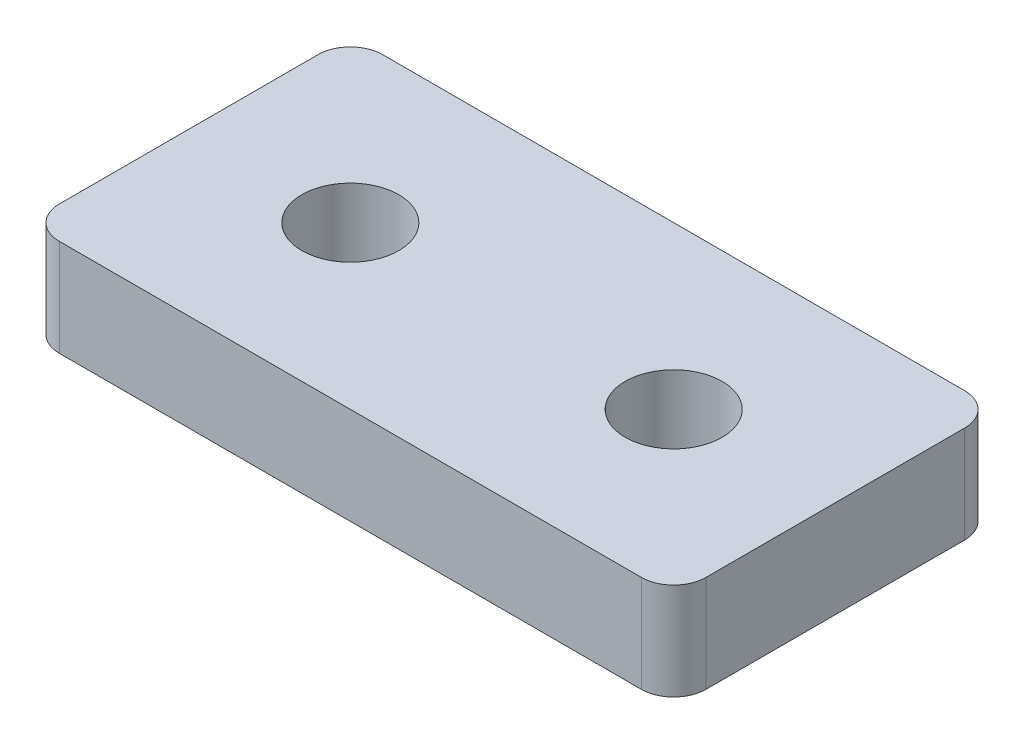
ISO-10303-21;
HEADER;
FILE_DESCRIPTION(('STEP AP214'),'2;1');
FILE_NAME('part.step','',(''),(''),'','','');
FILE_SCHEMA(('AUTOMOTIVE_DESIGN { 1 0 10303 214 1 1 1 1 }'));
ENDSEC;
DATA;
#1=APPLICATION_CONTEXT('core data for automotive mechanical design processes');
#2=APPLICATION_PROTOCOL_DEFINITION('international standard','automotive_design',2000,#1);
#3=PRODUCT_CONTEXT('',#1,'mechanical');
#4=PRODUCT('Part','Part','',(#3));
#5=PRODUCT_RELATED_PRODUCT_CATEGORY('part','',(#4));
#6=PRODUCT_DEFINITION_FORMATION('','',#4);
#7=PRODUCT_DEFINITION_CONTEXT('part definition',#1,'design');
#8=PRODUCT_DEFINITION('design','',#6,#7);
#9=PRODUCT_DEFINITION_SHAPE('','',#8);
#10=(LENGTH_UNIT() NAMED_UNIT(*) SI_UNIT(.MILLI.,.METRE.));
#11=(NAMED_UNIT(*) PLANE_ANGLE_UNIT() SI_UNIT($,.RADIAN.));
#12=(NAMED_UNIT(*) SI_UNIT($,.STERADIAN.) SOLID_ANGLE_UNIT());
#13=UNCERTAINTY_MEASURE_WITH_UNIT(LENGTH_MEASURE(1.E-05),#10,'distance_accuracy_value','');
#14=(GEOMETRIC_REPRESENTATION_CONTEXT(3) GLOBAL_UNCERTAINTY_ASSIGNED_CONTEXT((#13)) GLOBAL_UNIT_ASSIGNED_CONTEXT((#10,
#11,#12)) REPRESENTATION_CONTEXT('',''));
#15=CARTESIAN_POINT('',(0.,0.,0.));
#16=DIRECTION('',(0.,0.,1.));
#17=DIRECTION('',(1.,0.,0.));
#18=AXIS2_PLACEMENT_3D('',#15,#16,#17);
#19=CARTESIAN_POINT('',(0.,3.,0.));
#20=DIRECTION('',(0.,-1.,0.));
#21=DIRECTION('',(0.,0.,-1.));
#22=AXIS2_PLACEMENT_3D('',#19,#20,#21);
#23=PLANE('',#22);
#24=DIRECTION('',(-1.,0.,0.));
#25=VECTOR('',#24,1.);
#26=CARTESIAN_POINT('',(0.,3.,-10.));
#27=LINE('',#26,#25);
#28=CARTESIAN_POINT('',(19.,3.,-10.));
#29=VERTEX_POINT('',#28);
#30=CARTESIAN_POINT('',(1.,3.,-10.));
#31=VERTEX_POINT('',#30);
#32=EDGE_CURVE('E147',#29,#31,#27,.T.);
#33=ORIENTED_EDGE('',*,*,#32,.T.);
#34=CARTESIAN_POINT('',(1.,3.,-9.));
#35=DIRECTION('',(0.,-1.,0.));
#36=DIRECTION('',(0.,0.,-1.));
#37=AXIS2_PLACEMENT_3D('',#34,#35,#36);
#38=CIRCLE('',#37,1.);
#39=CARTESIAN_POINT('',(0.,3.,-9.));
#40=VERTEX_POINT('',#39);
#41=EDGE_CURVE('E166',#31,#40,#38,.F.);
#42=ORIENTED_EDGE('',*,*,#41,.T.);
#43=DIRECTION('',(0.,0.,1.));
#44=VECTOR('',#43,1.);
#45=CARTESIAN_POINT('',(0.,3.,0.));
#46=LINE('',#45,#44);
#47=CARTESIAN_POINT('',(0.,3.,-1.));
#48=VERTEX_POINT('',#47);
#49=EDGE_CURVE('E130',#40,#48,#46,.T.);
#50=ORIENTED_EDGE('',*,*,#49,.T.);
#51=CARTESIAN_POINT('',(1.,3.,-1.));
#52=DIRECTION('',(0.,-1.,0.));
#53=DIRECTION('',(0.,0.,-1.));
#54=AXIS2_PLACEMENT_3D('',#51,#52,#53);
#55=CIRCLE('',#54,1.);
#56=CARTESIAN_POINT('',(1.,3.,0.));
#57=VERTEX_POINT('',#56);
#58=EDGE_CURVE('E164',#48,#57,#55,.F.);
#59=ORIENTED_EDGE('',*,*,#58,.T.);
#60=DIRECTION('',(1.,0.,0.));
#61=VECTOR('',#60,1.);
#62=CARTESIAN_POINT('',(0.,3.,0.));
#63=LINE('',#62,#61);
#64=CARTESIAN_POINT('',(19.,3.,0.));
#65=VERTEX_POINT('',#64);
#66=EDGE_CURVE('E186',#57,#65,#63,.T.);
#67=ORIENTED_EDGE('',*,*,#66,.T.);
#68=CARTESIAN_POINT('',(19.,3.,-1.));
#69=DIRECTION('',(0.,-1.,0.));
#70=DIRECTION('',(0.,0.,-1.));
#71=AXIS2_PLACEMENT_3D('',#68,#69,#70);
#72=CIRCLE('',#71,1.);
#73=CARTESIAN_POINT('',(20.,3.,-1.));
#74=VERTEX_POINT('',#73);
#75=EDGE_CURVE('E65',#65,#74,#72,.F.);
#76=ORIENTED_EDGE('',*,*,#75,.T.);
#77=DIRECTION('',(0.,0.,-1.));
#78=VECTOR('',#77,1.);
#79=CARTESIAN_POINT('',(20.,3.,0.));
#80=LINE('',#79,#78);
#81=CARTESIAN_POINT('',(20.,3.,-9.));
#82=VERTEX_POINT('',#81);
#83=EDGE_CURVE('E176',#74,#82,#80,.T.);
#84=ORIENTED_EDGE('',*,*,#83,.T.);
#85=CARTESIAN_POINT('',(19.,3.,-9.));
#86=DIRECTION('',(0.,-1.,0.));
#87=DIRECTION('',(0.,0.,-1.));
#88=AXIS2_PLACEMENT_3D('',#85,#86,#87);
#89=CIRCLE('',#88,1.);
#90=EDGE_CURVE('E162',#82,#29,#89,.F.);
#91=ORIENTED_EDGE('',*,*,#90,.T.);
#92=EDGE_LOOP('',(#33,#42,#50,#59,#67,#76,#84,#91));
#93=FACE_BOUND('',#92,.T.);
#94=CARTESIAN_POINT('',(5.,3.,-5.));
#95=DIRECTION('',(0.,1.,0.));
#96=DIRECTION('',(0.,0.,1.));
#97=AXIS2_PLACEMENT_3D('',#94,#95,#96);
#98=CIRCLE('',#97,1.5);
#99=CARTESIAN_POINT('',(5.,3.,-3.5));
#100=VERTEX_POINT('',#99);
#101=EDGE_CURVE('E138',#100,#100,#98,.T.);
#102=ORIENTED_EDGE('',*,*,#101,.F.);
#103=EDGE_LOOP('',(#102));
#104=FACE_BOUND('',#103,.T.);
#105=CARTESIAN_POINT('',(15.,3.,-5.));
#106=DIRECTION('',(0.,1.,0.));
#107=DIRECTION('',(0.,0.,1.));
#108=AXIS2_PLACEMENT_3D('',#105,#106,#107);
#109=CIRCLE('',#108,1.5);
#110=CARTESIAN_POINT('',(15.,3.,-3.5));
#111=VERTEX_POINT('',#110);
#112=EDGE_CURVE('E191',#111,#111,#109,.T.);
#113=ORIENTED_EDGE('',*,*,#112,.F.);
#114=EDGE_LOOP('',(#113));
#115=FACE_BOUND('',#114,.T.);
#116=ADVANCED_FACE('F45',(#93,#104,#115),#23,.F.);
#117=CARTESIAN_POINT('',(0.,0.,0.));
#118=DIRECTION('',(0.,-1.,0.));
#119=DIRECTION('',(0.,0.,-1.));
#120=AXIS2_PLACEMENT_3D('',#117,#118,#119);
#121=PLANE('',#120);
#122=CARTESIAN_POINT('',(5.,0.,-5.));
#123=DIRECTION('',(0.,1.,0.));
#124=DIRECTION('',(0.,0.,1.));
#125=AXIS2_PLACEMENT_3D('',#122,#123,#124);
#126=CIRCLE('',#125,1.5);
#127=CARTESIAN_POINT('',(5.,0.,-3.5));
#128=VERTEX_POINT('',#127);
#129=EDGE_CURVE('E144',#128,#128,#126,.T.);
#130=ORIENTED_EDGE('',*,*,#129,.T.);
#131=EDGE_LOOP('',(#130));
#132=FACE_BOUND('',#131,.T.);
#133=DIRECTION('',(0.,0.,1.));
#134=VECTOR('',#133,1.);
#135=CARTESIAN_POINT('',(0.,0.,0.));
#136=LINE('',#135,#134);
#137=CARTESIAN_POINT('',(0.,0.,-9.));
#138=VERTEX_POINT('',#137);
#139=CARTESIAN_POINT('',(0.,0.,-1.));
#140=VERTEX_POINT('',#139);
#141=EDGE_CURVE('E127',#138,#140,#136,.T.);
#142=ORIENTED_EDGE('',*,*,#141,.F.);
#143=CARTESIAN_POINT('',(1.,0.,-9.));
#144=DIRECTION('',(0.,-1.,0.));
#145=DIRECTION('',(0.,0.,-1.));
#146=AXIS2_PLACEMENT_3D('',#143,#144,#145);
#147=CIRCLE('',#146,1.);
#148=CARTESIAN_POINT('',(1.,0.,-10.));
#149=VERTEX_POINT('',#148);
#150=EDGE_CURVE('E110',#138,#149,#147,.T.);
#151=ORIENTED_EDGE('',*,*,#150,.T.);
#152=DIRECTION('',(-1.,0.,0.));
#153=VECTOR('',#152,1.);
#154=CARTESIAN_POINT('',(0.,0.,-10.));
#155=LINE('',#154,#153);
#156=CARTESIAN_POINT('',(19.,0.,-10.));
#157=VERTEX_POINT('',#156);
#158=EDGE_CURVE('E151',#157,#149,#155,.T.);
#159=ORIENTED_EDGE('',*,*,#158,.F.);
#160=CARTESIAN_POINT('',(19.,0.,-9.));
#161=DIRECTION('',(0.,-1.,0.));
#162=DIRECTION('',(0.,0.,-1.));
#163=AXIS2_PLACEMENT_3D('',#160,#161,#162);
#164=CIRCLE('',#163,1.);
#165=CARTESIAN_POINT('',(20.,0.,-9.));
#166=VERTEX_POINT('',#165);
#167=EDGE_CURVE('E155',#157,#166,#164,.T.);
#168=ORIENTED_EDGE('',*,*,#167,.T.);
#169=DIRECTION('',(0.,0.,-1.));
#170=VECTOR('',#169,1.);
#171=CARTESIAN_POINT('',(20.,0.,0.));
#172=LINE('',#171,#170);
#173=CARTESIAN_POINT('',(20.,0.,-1.));
#174=VERTEX_POINT('',#173);
#175=EDGE_CURVE('E141',#174,#166,#172,.T.);
#176=ORIENTED_EDGE('',*,*,#175,.F.);
#177=CARTESIAN_POINT('',(19.,0.,-1.));
#178=DIRECTION('',(0.,-1.,0.));
#179=DIRECTION('',(0.,0.,-1.));
#180=AXIS2_PLACEMENT_3D('',#177,#178,#179);
#181=CIRCLE('',#180,1.);
#182=CARTESIAN_POINT('',(19.,0.,0.));
#183=VERTEX_POINT('',#182);
#184=EDGE_CURVE('E131',#174,#183,#181,.T.);
#185=ORIENTED_EDGE('',*,*,#184,.T.);
#186=DIRECTION('',(1.,0.,0.));
#187=VECTOR('',#186,1.);
#188=CARTESIAN_POINT('',(0.,0.,0.));
#189=LINE('',#188,#187);
#190=CARTESIAN_POINT('',(1.,0.,0.));
#191=VERTEX_POINT('',#190);
#192=EDGE_CURVE('E137',#191,#183,#189,.T.);
#193=ORIENTED_EDGE('',*,*,#192,.F.);
#194=CARTESIAN_POINT('',(1.,0.,-1.));
#195=DIRECTION('',(0.,-1.,0.));
#196=DIRECTION('',(0.,0.,-1.));
#197=AXIS2_PLACEMENT_3D('',#194,#195,#196);
#198=CIRCLE('',#197,1.);
#199=EDGE_CURVE('E121',#191,#140,#198,.T.);
#200=ORIENTED_EDGE('',*,*,#199,.T.);
#201=EDGE_LOOP('',(#142,#151,#159,#168,#176,#185,#193,#200));
#202=FACE_BOUND('',#201,.T.);
#203=CARTESIAN_POINT('',(15.,0.,-5.));
#204=DIRECTION('',(0.,1.,0.));
#205=DIRECTION('',(0.,0.,1.));
#206=AXIS2_PLACEMENT_3D('',#203,#204,#205);
#207=CIRCLE('',#206,1.5);
#208=CARTESIAN_POINT('',(15.,0.,-3.5));
#209=VERTEX_POINT('',#208);
#210=EDGE_CURVE('E193',#209,#209,#207,.T.);
#211=ORIENTED_EDGE('',*,*,#210,.T.);
#212=EDGE_LOOP('',(#211));
#213=FACE_BOUND('',#212,.T.);
#214=ADVANCED_FACE('F134',(#132,#202,#213),#121,.T.);
#215=CARTESIAN_POINT('',(0.,3.,0.));
#216=DIRECTION('',(1.,0.,0.));
#217=DIRECTION('',(0.,0.,-1.));
#218=AXIS2_PLACEMENT_3D('',#215,#216,#217);
#219=PLANE('',#218);
#220=ORIENTED_EDGE('',*,*,#49,.F.);
#221=DIRECTION('',(0.,-1.,0.));
#222=VECTOR('',#221,1.);
#223=CARTESIAN_POINT('',(0.,3.,-9.));
#224=LINE('',#223,#222);
#225=EDGE_CURVE('E114',#40,#138,#224,.T.);
#226=ORIENTED_EDGE('',*,*,#225,.T.);
#227=ORIENTED_EDGE('',*,*,#141,.T.);
#228=DIRECTION('',(0.,-1.,0.));
#229=VECTOR('',#228,1.);
#230=CARTESIAN_POINT('',(0.,3.,-1.));
#231=LINE('',#230,#229);
#232=EDGE_CURVE('E132',#140,#48,#231,.F.);
#233=ORIENTED_EDGE('',*,*,#232,.T.);
#234=EDGE_LOOP('',(#220,#226,#227,#233));
#235=FACE_BOUND('',#234,.T.);
#236=ADVANCED_FACE('F126',(#235),#219,.F.);
#237=CARTESIAN_POINT('',(0.,3.,0.));
#238=DIRECTION('',(0.,0.,-1.));
#239=DIRECTION('',(-1.,0.,0.));
#240=AXIS2_PLACEMENT_3D('',#237,#238,#239);
#241=PLANE('',#240);
#242=ORIENTED_EDGE('',*,*,#66,.F.);
#243=DIRECTION('',(0.,-1.,0.));
#244=VECTOR('',#243,1.);
#245=CARTESIAN_POINT('',(1.,3.,0.));
#246=LINE('',#245,#244);
#247=EDGE_CURVE('E170',#57,#191,#246,.T.);
#248=ORIENTED_EDGE('',*,*,#247,.T.);
#249=ORIENTED_EDGE('',*,*,#192,.T.);
#250=DIRECTION('',(0.,-1.,0.));
#251=VECTOR('',#250,1.);
#252=CARTESIAN_POINT('',(19.,3.,0.));
#253=LINE('',#252,#251);
#254=EDGE_CURVE('E168',#183,#65,#253,.F.);
#255=ORIENTED_EDGE('',*,*,#254,.T.);
#256=EDGE_LOOP('',(#242,#248,#249,#255));
#257=FACE_BOUND('',#256,.T.);
#258=ADVANCED_FACE('F219',(#257),#241,.F.);
#259=CARTESIAN_POINT('',(20.,3.,0.));
#260=DIRECTION('',(-1.,0.,0.));
#261=DIRECTION('',(0.,0.,1.));
#262=AXIS2_PLACEMENT_3D('',#259,#260,#261);
#263=PLANE('',#262);
#264=ORIENTED_EDGE('',*,*,#175,.T.);
#265=DIRECTION('',(0.,-1.,0.));
#266=VECTOR('',#265,1.);
#267=CARTESIAN_POINT('',(20.,3.,-9.));
#268=LINE('',#267,#266);
#269=EDGE_CURVE('E11',#166,#82,#268,.F.);
#270=ORIENTED_EDGE('',*,*,#269,.T.);
#271=ORIENTED_EDGE('',*,*,#83,.F.);
#272=DIRECTION('',(0.,-1.,0.));
#273=VECTOR('',#272,1.);
#274=CARTESIAN_POINT('',(20.,3.,-1.));
#275=LINE('',#274,#273);
#276=EDGE_CURVE('E53',#74,#174,#275,.T.);
#277=ORIENTED_EDGE('',*,*,#276,.T.);
#278=EDGE_LOOP('',(#264,#270,#271,#277));
#279=FACE_BOUND('',#278,.T.);
#280=ADVANCED_FACE('F175',(#279),#263,.F.);
#281=CARTESIAN_POINT('',(0.,3.,-10.));
#282=DIRECTION('',(0.,0.,1.));
#283=DIRECTION('',(1.,0.,0.));
#284=AXIS2_PLACEMENT_3D('',#281,#282,#283);
#285=PLANE('',#284);
#286=ORIENTED_EDGE('',*,*,#158,.T.);
#287=DIRECTION('',(0.,-1.,0.));
#288=VECTOR('',#287,1.);
#289=CARTESIAN_POINT('',(1.,3.,-10.));
#290=LINE('',#289,#288);
#291=EDGE_CURVE('E115',#149,#31,#290,.F.);
#292=ORIENTED_EDGE('',*,*,#291,.T.);
#293=ORIENTED_EDGE('',*,*,#32,.F.);
#294=DIRECTION('',(0.,-1.,0.));
#295=VECTOR('',#294,1.);
#296=CARTESIAN_POINT('',(19.,3.,-10.));
#297=LINE('',#296,#295);
#298=EDGE_CURVE('E120',#29,#157,#297,.T.);
#299=ORIENTED_EDGE('',*,*,#298,.T.);
#300=EDGE_LOOP('',(#286,#292,#293,#299));
#301=FACE_BOUND('',#300,.T.);
#302=ADVANCED_FACE('F184',(#301),#285,.F.);
#303=CARTESIAN_POINT('',(5.,3.,-5.));
#304=DIRECTION('',(0.,-1.,0.));
#305=DIRECTION('',(0.,0.,-1.));
#306=AXIS2_PLACEMENT_3D('',#303,#304,#305);
#307=CYLINDRICAL_SURFACE('',#306,1.5);
#308=ORIENTED_EDGE('',*,*,#101,.T.);
#309=EDGE_LOOP('',(#308));
#310=FACE_BOUND('',#309,.T.);
#311=ORIENTED_EDGE('',*,*,#129,.F.);
#312=EDGE_LOOP('',(#311));
#313=FACE_BOUND('',#312,.T.);
#314=ADVANCED_FACE('F212',(#310,#313),#307,.F.);
#315=CARTESIAN_POINT('',(15.,3.,-5.));
#316=DIRECTION('',(0.,-1.,0.));
#317=DIRECTION('',(0.,0.,-1.));
#318=AXIS2_PLACEMENT_3D('',#315,#316,#317);
#319=CYLINDRICAL_SURFACE('',#318,1.5);
#320=ORIENTED_EDGE('',*,*,#112,.T.);
#321=EDGE_LOOP('',(#320));
#322=FACE_BOUND('',#321,.T.);
#323=ORIENTED_EDGE('',*,*,#210,.F.);
#324=EDGE_LOOP('',(#323));
#325=FACE_BOUND('',#324,.T.);
#326=ADVANCED_FACE('F199',(#322,#325),#319,.F.);
#327=CARTESIAN_POINT('',(1.,3.,-9.));
#328=DIRECTION('',(0.,-1.,0.));
#329=DIRECTION('',(0.,0.,-1.));
#330=AXIS2_PLACEMENT_3D('',#327,#328,#329);
#331=CYLINDRICAL_SURFACE('',#330,1.);
#332=ORIENTED_EDGE('',*,*,#41,.F.);
#333=ORIENTED_EDGE('',*,*,#291,.F.);
#334=ORIENTED_EDGE('',*,*,#150,.F.);
#335=ORIENTED_EDGE('',*,*,#225,.F.);
#336=EDGE_LOOP('',(#332,#333,#334,#335));
#337=FACE_BOUND('',#336,.T.);
#338=ADVANCED_FACE('F113',(#337),#331,.T.);
#339=CARTESIAN_POINT('',(1.,3.,-1.));
#340=DIRECTION('',(0.,-1.,0.));
#341=DIRECTION('',(0.,0.,-1.));
#342=AXIS2_PLACEMENT_3D('',#339,#340,#341);
#343=CYLINDRICAL_SURFACE('',#342,1.);
#344=ORIENTED_EDGE('',*,*,#58,.F.);
#345=ORIENTED_EDGE('',*,*,#232,.F.);
#346=ORIENTED_EDGE('',*,*,#199,.F.);
#347=ORIENTED_EDGE('',*,*,#247,.F.);
#348=EDGE_LOOP('',(#344,#345,#346,#347));
#349=FACE_BOUND('',#348,.T.);
#350=ADVANCED_FACE('F227',(#349),#343,.T.);
#351=CARTESIAN_POINT('',(19.,3.,-9.));
#352=DIRECTION('',(0.,-1.,0.));
#353=DIRECTION('',(0.,0.,-1.));
#354=AXIS2_PLACEMENT_3D('',#351,#352,#353);
#355=CYLINDRICAL_SURFACE('',#354,1.);
#356=ORIENTED_EDGE('',*,*,#90,.F.);
#357=ORIENTED_EDGE('',*,*,#269,.F.);
#358=ORIENTED_EDGE('',*,*,#167,.F.);
#359=ORIENTED_EDGE('',*,*,#298,.F.);
#360=EDGE_LOOP('',(#356,#357,#358,#359));
#361=FACE_BOUND('',#360,.T.);
#362=ADVANCED_FACE('F181',(#361),#355,.T.);
#363=CARTESIAN_POINT('',(19.,3.,-1.));
#364=DIRECTION('',(0.,-1.,0.));
#365=DIRECTION('',(0.,0.,-1.));
#366=AXIS2_PLACEMENT_3D('',#363,#364,#365);
#367=CYLINDRICAL_SURFACE('',#366,1.);
#368=ORIENTED_EDGE('',*,*,#75,.F.);
#369=ORIENTED_EDGE('',*,*,#254,.F.);
#370=ORIENTED_EDGE('',*,*,#184,.F.);
#371=ORIENTED_EDGE('',*,*,#276,.F.);
#372=EDGE_LOOP('',(#368,#369,#370,#371));
#373=FACE_BOUND('',#372,.T.);
#374=ADVANCED_FACE('F47',(#373),#367,.T.);
#375=CLOSED_SHELL('',(#116,#214,#236,#258,#280,#302,#314,#326,#338,#350,#362,#374));
#376=MANIFOLD_SOLID_BREP('B2',#375);
#377=ADVANCED_BREP_SHAPE_REPRESENTATION('',(#18,#376),#14);
#378=SHAPE_DEFINITION_REPRESENTATION(#9,#377);
ENDSEC;
END-ISO-10303-21;
